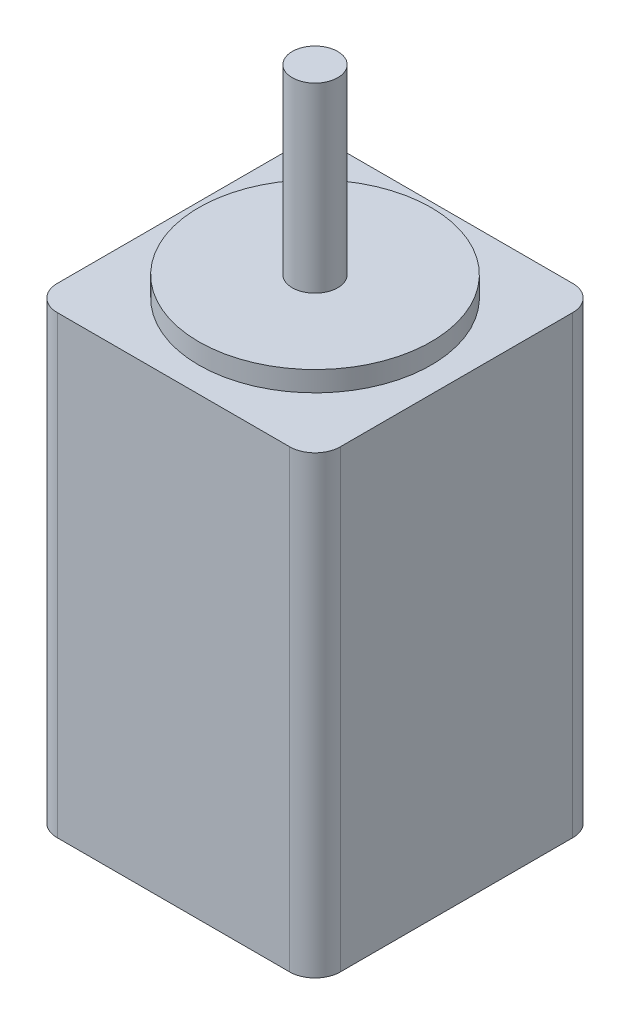
ISO-10303-21;
HEADER;
FILE_DESCRIPTION(('STEP AP214'),'2;1');
FILE_NAME('part.step','',(''),(''),'','','');
FILE_SCHEMA(('AUTOMOTIVE_DESIGN { 1 0 10303 214 1 1 1 1 }'));
ENDSEC;
DATA;
#1=APPLICATION_CONTEXT('core data for automotive mechanical design processes');
#2=APPLICATION_PROTOCOL_DEFINITION('international standard','automotive_design',2000,#1);
#3=PRODUCT_CONTEXT('',#1,'mechanical');
#4=PRODUCT('Part','Part','',(#3));
#5=PRODUCT_RELATED_PRODUCT_CATEGORY('part','',(#4));
#6=PRODUCT_DEFINITION_FORMATION('','',#4);
#7=PRODUCT_DEFINITION_CONTEXT('part definition',#1,'design');
#8=PRODUCT_DEFINITION('design','',#6,#7);
#9=PRODUCT_DEFINITION_SHAPE('','',#8);
#10=(LENGTH_UNIT() NAMED_UNIT(*) SI_UNIT(.MILLI.,.METRE.));
#11=(NAMED_UNIT(*) PLANE_ANGLE_UNIT() SI_UNIT($,.RADIAN.));
#12=(NAMED_UNIT(*) SI_UNIT($,.STERADIAN.) SOLID_ANGLE_UNIT());
#13=UNCERTAINTY_MEASURE_WITH_UNIT(LENGTH_MEASURE(1.E-05),#10,'distance_accuracy_value','');
#14=(GEOMETRIC_REPRESENTATION_CONTEXT(3) GLOBAL_UNCERTAINTY_ASSIGNED_CONTEXT((#13)) GLOBAL_UNIT_ASSIGNED_CONTEXT((#10,
#11,#12)) REPRESENTATION_CONTEXT('',''));
#15=CARTESIAN_POINT('',(0.,0.,0.));
#16=DIRECTION('',(0.,0.,1.));
#17=DIRECTION('',(1.,0.,0.));
#18=AXIS2_PLACEMENT_3D('',#15,#16,#17);
#19=CARTESIAN_POINT('',(0.,47.,0.));
#20=DIRECTION('',(0.,1.,0.));
#21=DIRECTION('',(0.,0.,1.));
#22=AXIS2_PLACEMENT_3D('',#19,#20,#21);
#23=PLANE('',#22);
#24=CARTESIAN_POINT('',(0.,47.,0.));
#25=DIRECTION('',(0.,1.,0.));
#26=DIRECTION('',(0.,0.,1.));
#27=AXIS2_PLACEMENT_3D('',#24,#25,#26);
#28=CIRCLE('',#27,11.5);
#29=CARTESIAN_POINT('',(0.,47.,11.5));
#30=VERTEX_POINT('',#29);
#31=EDGE_CURVE('E130',#30,#30,#28,.T.);
#32=ORIENTED_EDGE('',*,*,#31,.T.);
#33=EDGE_LOOP('',(#32));
#34=FACE_BOUND('',#33,.T.);
#35=CARTESIAN_POINT('',(0.,47.,0.));
#36=DIRECTION('',(0.,1.,0.));
#37=DIRECTION('',(0.,0.,1.));
#38=AXIS2_PLACEMENT_3D('',#35,#36,#37);
#39=CIRCLE('',#38,2.25);
#40=CARTESIAN_POINT('',(0.,47.,2.25));
#41=VERTEX_POINT('',#40);
#42=EDGE_CURVE('E140',#41,#41,#39,.F.);
#43=ORIENTED_EDGE('',*,*,#42,.T.);
#44=EDGE_LOOP('',(#43));
#45=FACE_BOUND('',#44,.T.);
#46=ADVANCED_FACE('F32',(#34,#45),#23,.T.);
#47=CARTESIAN_POINT('',(0.,45.,0.));
#48=DIRECTION('',(0.,-1.,0.));
#49=DIRECTION('',(0.,0.,-1.));
#50=AXIS2_PLACEMENT_3D('',#47,#48,#49);
#51=PLANE('',#50);
#52=DIRECTION('',(0.,0.,1.));
#53=VECTOR('',#52,1.);
#54=CARTESIAN_POINT('',(-14.,45.,14.));
#55=LINE('',#54,#53);
#56=CARTESIAN_POINT('',(-14.,45.,-11.5));
#57=VERTEX_POINT('',#56);
#58=CARTESIAN_POINT('',(-14.,45.,11.5));
#59=VERTEX_POINT('',#58);
#60=EDGE_CURVE('E135',#57,#59,#55,.T.);
#61=ORIENTED_EDGE('',*,*,#60,.T.);
#62=CARTESIAN_POINT('',(-11.5,45.,11.5));
#63=DIRECTION('',(0.,-1.,0.));
#64=DIRECTION('',(0.,0.,-1.));
#65=AXIS2_PLACEMENT_3D('',#62,#63,#64);
#66=CIRCLE('',#65,2.5);
#67=CARTESIAN_POINT('',(-11.5,45.,14.));
#68=VERTEX_POINT('',#67);
#69=EDGE_CURVE('E157',#59,#68,#66,.F.);
#70=ORIENTED_EDGE('',*,*,#69,.T.);
#71=DIRECTION('',(1.,0.,0.));
#72=VECTOR('',#71,1.);
#73=CARTESIAN_POINT('',(-14.,45.,14.));
#74=LINE('',#73,#72);
#75=CARTESIAN_POINT('',(11.5,45.,14.));
#76=VERTEX_POINT('',#75);
#77=EDGE_CURVE('E118',#68,#76,#74,.T.);
#78=ORIENTED_EDGE('',*,*,#77,.T.);
#79=CARTESIAN_POINT('',(11.5,45.,11.5));
#80=DIRECTION('',(0.,-1.,0.));
#81=DIRECTION('',(0.,0.,-1.));
#82=AXIS2_PLACEMENT_3D('',#79,#80,#81);
#83=CIRCLE('',#82,2.5);
#84=CARTESIAN_POINT('',(14.,45.,11.5));
#85=VERTEX_POINT('',#84);
#86=EDGE_CURVE('E155',#76,#85,#83,.F.);
#87=ORIENTED_EDGE('',*,*,#86,.T.);
#88=DIRECTION('',(0.,0.,-1.));
#89=VECTOR('',#88,1.);
#90=CARTESIAN_POINT('',(14.,45.,14.));
#91=LINE('',#90,#89);
#92=CARTESIAN_POINT('',(14.,45.,-11.5));
#93=VERTEX_POINT('',#92);
#94=EDGE_CURVE('E168',#85,#93,#91,.T.);
#95=ORIENTED_EDGE('',*,*,#94,.T.);
#96=CARTESIAN_POINT('',(11.5,45.,-11.5));
#97=DIRECTION('',(0.,-1.,0.));
#98=DIRECTION('',(0.,0.,-1.));
#99=AXIS2_PLACEMENT_3D('',#96,#97,#98);
#100=CIRCLE('',#99,2.5);
#101=CARTESIAN_POINT('',(11.5,45.,-14.));
#102=VERTEX_POINT('',#101);
#103=EDGE_CURVE('E53',#93,#102,#100,.F.);
#104=ORIENTED_EDGE('',*,*,#103,.T.);
#105=DIRECTION('',(-1.,0.,0.));
#106=VECTOR('',#105,1.);
#107=CARTESIAN_POINT('',(-14.,45.,-14.));
#108=LINE('',#107,#106);
#109=CARTESIAN_POINT('',(-11.5,45.,-14.));
#110=VERTEX_POINT('',#109);
#111=EDGE_CURVE('E139',#102,#110,#108,.T.);
#112=ORIENTED_EDGE('',*,*,#111,.T.);
#113=CARTESIAN_POINT('',(-11.5,45.,-11.5));
#114=DIRECTION('',(0.,-1.,0.));
#115=DIRECTION('',(0.,0.,-1.));
#116=AXIS2_PLACEMENT_3D('',#113,#114,#115);
#117=CIRCLE('',#116,2.5);
#118=EDGE_CURVE('E152',#110,#57,#117,.F.);
#119=ORIENTED_EDGE('',*,*,#118,.T.);
#120=EDGE_LOOP('',(#61,#70,#78,#87,#95,#104,#112,#119));
#121=FACE_BOUND('',#120,.T.);
#122=CARTESIAN_POINT('',(0.,45.,0.));
#123=DIRECTION('',(0.,-1.,0.));
#124=DIRECTION('',(0.,0.,-1.));
#125=AXIS2_PLACEMENT_3D('',#122,#123,#124);
#126=CIRCLE('',#125,11.5);
#127=CARTESIAN_POINT('',(0.,45.,-11.5));
#128=VERTEX_POINT('',#127);
#129=EDGE_CURVE('E136',#128,#128,#126,.F.);
#130=ORIENTED_EDGE('',*,*,#129,.F.);
#131=EDGE_LOOP('',(#130));
#132=FACE_BOUND('',#131,.T.);
#133=ADVANCED_FACE('F204',(#121,#132),#51,.F.);
#134=CARTESIAN_POINT('',(-14.,45.,14.));
#135=DIRECTION('',(1.,0.,0.));
#136=DIRECTION('',(0.,0.,-1.));
#137=AXIS2_PLACEMENT_3D('',#134,#135,#136);
#138=PLANE('',#137);
#139=DIRECTION('',(0.,0.,1.));
#140=VECTOR('',#139,1.);
#141=CARTESIAN_POINT('',(-14.,0.,14.));
#142=LINE('',#141,#140);
#143=CARTESIAN_POINT('',(-14.,0.,-11.5));
#144=VERTEX_POINT('',#143);
#145=CARTESIAN_POINT('',(-14.,0.,11.5));
#146=VERTEX_POINT('',#145);
#147=EDGE_CURVE('E125',#144,#146,#142,.T.);
#148=ORIENTED_EDGE('',*,*,#147,.T.);
#149=DIRECTION('',(0.,-1.,0.));
#150=VECTOR('',#149,1.);
#151=CARTESIAN_POINT('',(-14.,45.,11.5));
#152=LINE('',#151,#150);
#153=EDGE_CURVE('E103',#146,#59,#152,.F.);
#154=ORIENTED_EDGE('',*,*,#153,.T.);
#155=ORIENTED_EDGE('',*,*,#60,.F.);
#156=DIRECTION('',(0.,-1.,0.));
#157=VECTOR('',#156,1.);
#158=CARTESIAN_POINT('',(-14.,45.,-11.5));
#159=LINE('',#158,#157);
#160=EDGE_CURVE('E108',#57,#144,#159,.T.);
#161=ORIENTED_EDGE('',*,*,#160,.T.);
#162=EDGE_LOOP('',(#148,#154,#155,#161));
#163=FACE_BOUND('',#162,.T.);
#164=ADVANCED_FACE('F209',(#163),#138,.F.);
#165=CARTESIAN_POINT('',(-14.,45.,14.));
#166=DIRECTION('',(0.,0.,-1.));
#167=DIRECTION('',(-1.,0.,0.));
#168=AXIS2_PLACEMENT_3D('',#165,#166,#167);
#169=PLANE('',#168);
#170=ORIENTED_EDGE('',*,*,#77,.F.);
#171=DIRECTION('',(0.,-1.,0.));
#172=VECTOR('',#171,1.);
#173=CARTESIAN_POINT('',(-11.5,45.,14.));
#174=LINE('',#173,#172);
#175=CARTESIAN_POINT('',(-11.5,0.,14.));
#176=VERTEX_POINT('',#175);
#177=EDGE_CURVE('E102',#68,#176,#174,.T.);
#178=ORIENTED_EDGE('',*,*,#177,.T.);
#179=DIRECTION('',(1.,0.,0.));
#180=VECTOR('',#179,1.);
#181=CARTESIAN_POINT('',(-14.,0.,14.));
#182=LINE('',#181,#180);
#183=CARTESIAN_POINT('',(11.5,0.,14.));
#184=VERTEX_POINT('',#183);
#185=EDGE_CURVE('E115',#176,#184,#182,.T.);
#186=ORIENTED_EDGE('',*,*,#185,.T.);
#187=DIRECTION('',(0.,-1.,0.));
#188=VECTOR('',#187,1.);
#189=CARTESIAN_POINT('',(11.5,45.,14.));
#190=LINE('',#189,#188);
#191=EDGE_CURVE('E120',#184,#76,#190,.F.);
#192=ORIENTED_EDGE('',*,*,#191,.T.);
#193=EDGE_LOOP('',(#170,#178,#186,#192));
#194=FACE_BOUND('',#193,.T.);
#195=ADVANCED_FACE('F114',(#194),#169,.F.);
#196=CARTESIAN_POINT('',(14.,45.,14.));
#197=DIRECTION('',(-1.,0.,0.));
#198=DIRECTION('',(0.,0.,1.));
#199=AXIS2_PLACEMENT_3D('',#196,#197,#198);
#200=PLANE('',#199);
#201=ORIENTED_EDGE('',*,*,#94,.F.);
#202=DIRECTION('',(0.,-1.,0.));
#203=VECTOR('',#202,1.);
#204=CARTESIAN_POINT('',(14.,45.,11.5));
#205=LINE('',#204,#203);
#206=CARTESIAN_POINT('',(14.,0.,11.5));
#207=VERTEX_POINT('',#206);
#208=EDGE_CURVE('E161',#85,#207,#205,.T.);
#209=ORIENTED_EDGE('',*,*,#208,.T.);
#210=DIRECTION('',(0.,0.,-1.));
#211=VECTOR('',#210,1.);
#212=CARTESIAN_POINT('',(14.,0.,14.));
#213=LINE('',#212,#211);
#214=CARTESIAN_POINT('',(14.,0.,-11.5));
#215=VERTEX_POINT('',#214);
#216=EDGE_CURVE('E124',#207,#215,#213,.T.);
#217=ORIENTED_EDGE('',*,*,#216,.T.);
#218=DIRECTION('',(0.,-1.,0.));
#219=VECTOR('',#218,1.);
#220=CARTESIAN_POINT('',(14.,45.,-11.5));
#221=LINE('',#220,#219);
#222=EDGE_CURVE('E159',#215,#93,#221,.F.);
#223=ORIENTED_EDGE('',*,*,#222,.T.);
#224=EDGE_LOOP('',(#201,#209,#217,#223));
#225=FACE_BOUND('',#224,.T.);
#226=ADVANCED_FACE('F166',(#225),#200,.F.);
#227=CARTESIAN_POINT('',(-14.,45.,-14.));
#228=DIRECTION('',(0.,0.,1.));
#229=DIRECTION('',(1.,0.,0.));
#230=AXIS2_PLACEMENT_3D('',#227,#228,#229);
#231=PLANE('',#230);
#232=ORIENTED_EDGE('',*,*,#111,.F.);
#233=DIRECTION('',(0.,-1.,0.));
#234=VECTOR('',#233,1.);
#235=CARTESIAN_POINT('',(11.5,45.,-14.));
#236=LINE('',#235,#234);
#237=CARTESIAN_POINT('',(11.5,0.,-14.));
#238=VERTEX_POINT('',#237);
#239=EDGE_CURVE('E11',#102,#238,#236,.T.);
#240=ORIENTED_EDGE('',*,*,#239,.T.);
#241=DIRECTION('',(-1.,0.,0.));
#242=VECTOR('',#241,1.);
#243=CARTESIAN_POINT('',(-14.,0.,-14.));
#244=LINE('',#243,#242);
#245=CARTESIAN_POINT('',(-11.5,0.,-14.));
#246=VERTEX_POINT('',#245);
#247=EDGE_CURVE('E128',#238,#246,#244,.T.);
#248=ORIENTED_EDGE('',*,*,#247,.T.);
#249=DIRECTION('',(0.,-1.,0.));
#250=VECTOR('',#249,1.);
#251=CARTESIAN_POINT('',(-11.5,45.,-14.));
#252=LINE('',#251,#250);
#253=EDGE_CURVE('E40',#246,#110,#252,.F.);
#254=ORIENTED_EDGE('',*,*,#253,.T.);
#255=EDGE_LOOP('',(#232,#240,#248,#254));
#256=FACE_BOUND('',#255,.T.);
#257=ADVANCED_FACE('F175',(#256),#231,.F.);
#258=CARTESIAN_POINT('',(0.,0.,0.));
#259=DIRECTION('',(0.,-1.,0.));
#260=DIRECTION('',(0.,0.,-1.));
#261=AXIS2_PLACEMENT_3D('',#258,#259,#260);
#262=PLANE('',#261);
#263=ORIENTED_EDGE('',*,*,#185,.F.);
#264=CARTESIAN_POINT('',(-11.5,0.,11.5));
#265=DIRECTION('',(0.,-1.,0.));
#266=DIRECTION('',(0.,0.,-1.));
#267=AXIS2_PLACEMENT_3D('',#264,#265,#266);
#268=CIRCLE('',#267,2.5);
#269=EDGE_CURVE('E98',#176,#146,#268,.T.);
#270=ORIENTED_EDGE('',*,*,#269,.T.);
#271=ORIENTED_EDGE('',*,*,#147,.F.);
#272=CARTESIAN_POINT('',(-11.5,0.,-11.5));
#273=DIRECTION('',(0.,-1.,0.));
#274=DIRECTION('',(0.,0.,-1.));
#275=AXIS2_PLACEMENT_3D('',#272,#273,#274);
#276=CIRCLE('',#275,2.5);
#277=EDGE_CURVE('E119',#144,#246,#276,.T.);
#278=ORIENTED_EDGE('',*,*,#277,.T.);
#279=ORIENTED_EDGE('',*,*,#247,.F.);
#280=CARTESIAN_POINT('',(11.5,0.,-11.5));
#281=DIRECTION('',(0.,-1.,0.));
#282=DIRECTION('',(0.,0.,-1.));
#283=AXIS2_PLACEMENT_3D('',#280,#281,#282);
#284=CIRCLE('',#283,2.5);
#285=EDGE_CURVE('E146',#238,#215,#284,.T.);
#286=ORIENTED_EDGE('',*,*,#285,.T.);
#287=ORIENTED_EDGE('',*,*,#216,.F.);
#288=CARTESIAN_POINT('',(11.5,0.,11.5));
#289=DIRECTION('',(0.,-1.,0.));
#290=DIRECTION('',(0.,0.,-1.));
#291=AXIS2_PLACEMENT_3D('',#288,#289,#290);
#292=CIRCLE('',#291,2.5);
#293=EDGE_CURVE('E109',#207,#184,#292,.T.);
#294=ORIENTED_EDGE('',*,*,#293,.T.);
#295=EDGE_LOOP('',(#263,#270,#271,#278,#279,#286,#287,#294));
#296=FACE_BOUND('',#295,.T.);
#297=ADVANCED_FACE('F122',(#296),#262,.T.);
#298=CARTESIAN_POINT('',(0.,47.,0.));
#299=DIRECTION('',(0.,-1.,0.));
#300=DIRECTION('',(0.,0.,-1.));
#301=AXIS2_PLACEMENT_3D('',#298,#299,#300);
#302=CYLINDRICAL_SURFACE('',#301,11.5);
#303=ORIENTED_EDGE('',*,*,#31,.F.);
#304=EDGE_LOOP('',(#303));
#305=FACE_BOUND('',#304,.T.);
#306=ORIENTED_EDGE('',*,*,#129,.T.);
#307=EDGE_LOOP('',(#306));
#308=FACE_BOUND('',#307,.T.);
#309=ADVANCED_FACE('F191',(#305,#308),#302,.T.);
#310=CARTESIAN_POINT('',(0.,65.,0.));
#311=DIRECTION('',(0.,-1.,0.));
#312=DIRECTION('',(0.,0.,-1.));
#313=AXIS2_PLACEMENT_3D('',#310,#311,#312);
#314=CYLINDRICAL_SURFACE('',#313,2.25);
#315=ORIENTED_EDGE('',*,*,#42,.F.);
#316=EDGE_LOOP('',(#315));
#317=FACE_BOUND('',#316,.T.);
#318=CARTESIAN_POINT('',(0.,65.,0.));
#319=DIRECTION('',(0.,1.,0.));
#320=DIRECTION('',(0.,0.,1.));
#321=AXIS2_PLACEMENT_3D('',#318,#319,#320);
#322=CIRCLE('',#321,2.25);
#323=CARTESIAN_POINT('',(0.,65.,2.25));
#324=VERTEX_POINT('',#323);
#325=EDGE_CURVE('E143',#324,#324,#322,.T.);
#326=ORIENTED_EDGE('',*,*,#325,.F.);
#327=EDGE_LOOP('',(#326));
#328=FACE_BOUND('',#327,.T.);
#329=ADVANCED_FACE('F189',(#317,#328),#314,.T.);
#330=CARTESIAN_POINT('',(0.,65.,0.));
#331=DIRECTION('',(0.,1.,0.));
#332=DIRECTION('',(0.,0.,1.));
#333=AXIS2_PLACEMENT_3D('',#330,#331,#332);
#334=PLANE('',#333);
#335=ORIENTED_EDGE('',*,*,#325,.T.);
#336=EDGE_LOOP('',(#335));
#337=FACE_BOUND('',#336,.T.);
#338=ADVANCED_FACE('F187',(#337),#334,.T.);
#339=CARTESIAN_POINT('',(-11.5,45.,11.5));
#340=DIRECTION('',(0.,-1.,0.));
#341=DIRECTION('',(0.,0.,-1.));
#342=AXIS2_PLACEMENT_3D('',#339,#340,#341);
#343=CYLINDRICAL_SURFACE('',#342,2.5);
#344=ORIENTED_EDGE('',*,*,#69,.F.);
#345=ORIENTED_EDGE('',*,*,#153,.F.);
#346=ORIENTED_EDGE('',*,*,#269,.F.);
#347=ORIENTED_EDGE('',*,*,#177,.F.);
#348=EDGE_LOOP('',(#344,#345,#346,#347));
#349=FACE_BOUND('',#348,.T.);
#350=ADVANCED_FACE('F101',(#349),#343,.T.);
#351=CARTESIAN_POINT('',(11.5,45.,11.5));
#352=DIRECTION('',(0.,-1.,0.));
#353=DIRECTION('',(0.,0.,-1.));
#354=AXIS2_PLACEMENT_3D('',#351,#352,#353);
#355=CYLINDRICAL_SURFACE('',#354,2.5);
#356=ORIENTED_EDGE('',*,*,#86,.F.);
#357=ORIENTED_EDGE('',*,*,#191,.F.);
#358=ORIENTED_EDGE('',*,*,#293,.F.);
#359=ORIENTED_EDGE('',*,*,#208,.F.);
#360=EDGE_LOOP('',(#356,#357,#358,#359));
#361=FACE_BOUND('',#360,.T.);
#362=ADVANCED_FACE('F226',(#361),#355,.T.);
#363=CARTESIAN_POINT('',(11.5,45.,-11.5));
#364=DIRECTION('',(0.,-1.,0.));
#365=DIRECTION('',(0.,0.,-1.));
#366=AXIS2_PLACEMENT_3D('',#363,#364,#365);
#367=CYLINDRICAL_SURFACE('',#366,2.5);
#368=ORIENTED_EDGE('',*,*,#103,.F.);
#369=ORIENTED_EDGE('',*,*,#222,.F.);
#370=ORIENTED_EDGE('',*,*,#285,.F.);
#371=ORIENTED_EDGE('',*,*,#239,.F.);
#372=EDGE_LOOP('',(#368,#369,#370,#371));
#373=FACE_BOUND('',#372,.T.);
#374=ADVANCED_FACE('F174',(#373),#367,.T.);
#375=CARTESIAN_POINT('',(-11.5,45.,-11.5));
#376=DIRECTION('',(0.,-1.,0.));
#377=DIRECTION('',(0.,0.,-1.));
#378=AXIS2_PLACEMENT_3D('',#375,#376,#377);
#379=CYLINDRICAL_SURFACE('',#378,2.5);
#380=ORIENTED_EDGE('',*,*,#118,.F.);
#381=ORIENTED_EDGE('',*,*,#253,.F.);
#382=ORIENTED_EDGE('',*,*,#277,.F.);
#383=ORIENTED_EDGE('',*,*,#160,.F.);
#384=EDGE_LOOP('',(#380,#381,#382,#383));
#385=FACE_BOUND('',#384,.T.);
#386=ADVANCED_FACE('F34',(#385),#379,.T.);
#387=CLOSED_SHELL('',(#46,#133,#164,#195,#226,#257,#297,#309,#329,#338,#350,#362,#374,#386));
#388=MANIFOLD_SOLID_BREP('B2',#387);
#389=ADVANCED_BREP_SHAPE_REPRESENTATION('',(#18,#388),#14);
#390=SHAPE_DEFINITION_REPRESENTATION(#9,#389);
ENDSEC;
END-ISO-10303-21;
